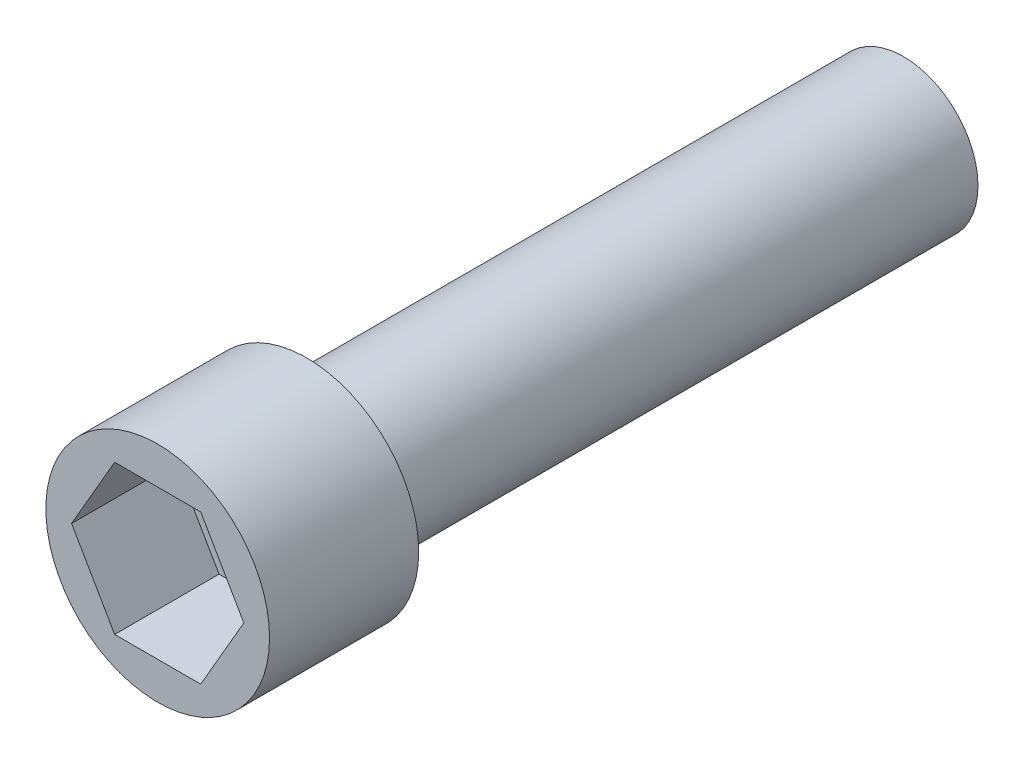
ISO-10303-21;
HEADER;
FILE_DESCRIPTION(('STEP AP214'),'2;1');
FILE_NAME('part.step','',(''),(''),'','','');
FILE_SCHEMA(('AUTOMOTIVE_DESIGN { 1 0 10303 214 1 1 1 1 }'));
ENDSEC;
DATA;
#1=APPLICATION_CONTEXT('core data for automotive mechanical design processes');
#2=APPLICATION_PROTOCOL_DEFINITION('international standard','automotive_design',2000,#1);
#3=PRODUCT_CONTEXT('',#1,'mechanical');
#4=PRODUCT('Part','Part','',(#3));
#5=PRODUCT_RELATED_PRODUCT_CATEGORY('part','',(#4));
#6=PRODUCT_DEFINITION_FORMATION('','',#4);
#7=PRODUCT_DEFINITION_CONTEXT('part definition',#1,'design');
#8=PRODUCT_DEFINITION('design','',#6,#7);
#9=PRODUCT_DEFINITION_SHAPE('','',#8);
#10=(LENGTH_UNIT() NAMED_UNIT(*) SI_UNIT(.MILLI.,.METRE.));
#11=(NAMED_UNIT(*) PLANE_ANGLE_UNIT() SI_UNIT($,.RADIAN.));
#12=(NAMED_UNIT(*) SI_UNIT($,.STERADIAN.) SOLID_ANGLE_UNIT());
#13=UNCERTAINTY_MEASURE_WITH_UNIT(LENGTH_MEASURE(1.E-05),#10,'distance_accuracy_value','');
#14=(GEOMETRIC_REPRESENTATION_CONTEXT(3) GLOBAL_UNCERTAINTY_ASSIGNED_CONTEXT((#13)) GLOBAL_UNIT_ASSIGNED_CONTEXT((#10,
#11,#12)) REPRESENTATION_CONTEXT('',''));
#15=CARTESIAN_POINT('',(0.,0.,0.));
#16=DIRECTION('',(0.,0.,1.));
#17=DIRECTION('',(1.,0.,0.));
#18=AXIS2_PLACEMENT_3D('',#15,#16,#17);
#19=CARTESIAN_POINT('',(0.,0.,0.));
#20=DIRECTION('',(0.,0.,1.));
#21=DIRECTION('',(1.,0.,0.));
#22=AXIS2_PLACEMENT_3D('',#19,#20,#21);
#23=PLANE('',#22);
#24=CARTESIAN_POINT('',(0.,0.,0.));
#25=DIRECTION('',(0.,0.,1.));
#26=DIRECTION('',(1.,0.,0.));
#27=AXIS2_PLACEMENT_3D('',#24,#25,#26);
#28=CIRCLE('',#27,7.5);
#29=CARTESIAN_POINT('',(7.5,0.,0.));
#30=VERTEX_POINT('',#29);
#31=EDGE_CURVE('E159',#30,#30,#28,.T.);
#32=ORIENTED_EDGE('',*,*,#31,.T.);
#33=EDGE_LOOP('',(#32));
#34=FACE_BOUND('',#33,.T.);
#35=DIRECTION('',(1.,0.,0.));
#36=VECTOR('',#35,1.);
#37=CARTESIAN_POINT('',(0.,5.,0.));
#38=LINE('',#37,#36);
#39=CARTESIAN_POINT('',(-2.88675134594815,4.99999999999999,0.));
#40=VERTEX_POINT('',#39);
#41=CARTESIAN_POINT('',(2.88675134594812,5.00000000000001,0.));
#42=VERTEX_POINT('',#41);
#43=EDGE_CURVE('E70',#40,#42,#38,.T.);
#44=ORIENTED_EDGE('',*,*,#43,.T.);
#45=DIRECTION('',(0.500000000000001,-0.866025403784438,0.));
#46=VECTOR('',#45,1.);
#47=CARTESIAN_POINT('',(4.33012701892219,2.50000000000001,0.));
#48=LINE('',#47,#46);
#49=CARTESIAN_POINT('',(5.77350269189626,0.,0.));
#50=VERTEX_POINT('',#49);
#51=EDGE_CURVE('E12',#42,#50,#48,.T.);
#52=ORIENTED_EDGE('',*,*,#51,.T.);
#53=DIRECTION('',(-0.499999999999995,-0.866025403784442,0.));
#54=VECTOR('',#53,1.);
#55=CARTESIAN_POINT('',(4.33012701892223,-2.49999999999999,0.));
#56=LINE('',#55,#54);
#57=CARTESIAN_POINT('',(2.88675134594819,-4.99999999999997,0.));
#58=VERTEX_POINT('',#57);
#59=EDGE_CURVE('E158',#50,#58,#56,.T.);
#60=ORIENTED_EDGE('',*,*,#59,.T.);
#61=DIRECTION('',(-1.,0.,0.));
#62=VECTOR('',#61,1.);
#63=CARTESIAN_POINT('',(0.,-5.,0.));
#64=LINE('',#63,#62);
#65=CARTESIAN_POINT('',(-2.88675134594808,-5.00000000000003,0.));
#66=VERTEX_POINT('',#65);
#67=EDGE_CURVE('E166',#58,#66,#64,.T.);
#68=ORIENTED_EDGE('',*,*,#67,.T.);
#69=DIRECTION('',(-0.500000000000007,0.866025403784435,0.));
#70=VECTOR('',#69,1.);
#71=CARTESIAN_POINT('',(-4.33012701892217,-2.50000000000003,0.));
#72=LINE('',#71,#70);
#73=CARTESIAN_POINT('',(-5.77350269189626,0.,0.));
#74=VERTEX_POINT('',#73);
#75=EDGE_CURVE('E169',#66,#74,#72,.T.);
#76=ORIENTED_EDGE('',*,*,#75,.T.);
#77=DIRECTION('',(0.499999999999995,0.866025403784442,0.));
#78=VECTOR('',#77,1.);
#79=CARTESIAN_POINT('',(-4.33012701892221,2.49999999999997,0.));
#80=LINE('',#79,#78);
#81=EDGE_CURVE('E172',#74,#40,#80,.T.);
#82=ORIENTED_EDGE('',*,*,#81,.T.);
#83=EDGE_LOOP('',(#44,#52,#60,#68,#76,#82));
#84=FACE_BOUND('',#83,.T.);
#85=ADVANCED_FACE('F62',(#34,#84),#23,.T.);
#86=CARTESIAN_POINT('',(0.,0.,-10.));
#87=DIRECTION('',(0.,0.,1.));
#88=DIRECTION('',(1.,0.,0.));
#89=AXIS2_PLACEMENT_3D('',#86,#87,#88);
#90=CYLINDRICAL_SURFACE('',#89,7.5);
#91=CARTESIAN_POINT('',(0.,0.,-10.));
#92=DIRECTION('',(0.,0.,1.));
#93=DIRECTION('',(1.,0.,0.));
#94=AXIS2_PLACEMENT_3D('',#91,#92,#93);
#95=CIRCLE('',#94,7.5);
#96=CARTESIAN_POINT('',(7.5,0.,-10.));
#97=VERTEX_POINT('',#96);
#98=EDGE_CURVE('E155',#97,#97,#95,.T.);
#99=ORIENTED_EDGE('',*,*,#98,.T.);
#100=EDGE_LOOP('',(#99));
#101=FACE_BOUND('',#100,.T.);
#102=ORIENTED_EDGE('',*,*,#31,.F.);
#103=EDGE_LOOP('',(#102));
#104=FACE_BOUND('',#103,.T.);
#105=ADVANCED_FACE('F64',(#101,#104),#90,.T.);
#106=CARTESIAN_POINT('',(0.,0.,-10.));
#107=DIRECTION('',(0.,0.,1.));
#108=DIRECTION('',(1.,0.,0.));
#109=AXIS2_PLACEMENT_3D('',#106,#107,#108);
#110=PLANE('',#109);
#111=CARTESIAN_POINT('',(0.,0.,-10.));
#112=DIRECTION('',(0.,0.,1.));
#113=DIRECTION('',(1.,0.,0.));
#114=AXIS2_PLACEMENT_3D('',#111,#112,#113);
#115=CIRCLE('',#114,5.);
#116=CARTESIAN_POINT('',(5.,0.,-10.));
#117=VERTEX_POINT('',#116);
#118=EDGE_CURVE('E154',#117,#117,#115,.T.);
#119=ORIENTED_EDGE('',*,*,#118,.T.);
#120=EDGE_LOOP('',(#119));
#121=FACE_BOUND('',#120,.T.);
#122=ORIENTED_EDGE('',*,*,#98,.F.);
#123=EDGE_LOOP('',(#122));
#124=FACE_BOUND('',#123,.T.);
#125=ADVANCED_FACE('F201',(#121,#124),#110,.F.);
#126=CARTESIAN_POINT('',(0.,0.,-50.));
#127=DIRECTION('',(0.,0.,1.));
#128=DIRECTION('',(1.,0.,0.));
#129=AXIS2_PLACEMENT_3D('',#126,#127,#128);
#130=CYLINDRICAL_SURFACE('',#129,5.);
#131=CARTESIAN_POINT('',(0.,0.,-50.));
#132=DIRECTION('',(0.,0.,1.));
#133=DIRECTION('',(1.,0.,0.));
#134=AXIS2_PLACEMENT_3D('',#131,#132,#133);
#135=CIRCLE('',#134,5.);
#136=CARTESIAN_POINT('',(5.,0.,-50.));
#137=VERTEX_POINT('',#136);
#138=EDGE_CURVE('E120',#137,#137,#135,.T.);
#139=ORIENTED_EDGE('',*,*,#138,.T.);
#140=EDGE_LOOP('',(#139));
#141=FACE_BOUND('',#140,.T.);
#142=ORIENTED_EDGE('',*,*,#118,.F.);
#143=EDGE_LOOP('',(#142));
#144=FACE_BOUND('',#143,.T.);
#145=ADVANCED_FACE('F206',(#141,#144),#130,.T.);
#146=CARTESIAN_POINT('',(0.,0.,-50.));
#147=DIRECTION('',(0.,0.,1.));
#148=DIRECTION('',(1.,0.,0.));
#149=AXIS2_PLACEMENT_3D('',#146,#147,#148);
#150=PLANE('',#149);
#151=ORIENTED_EDGE('',*,*,#138,.F.);
#152=EDGE_LOOP('',(#151));
#153=FACE_BOUND('',#152,.T.);
#154=ADVANCED_FACE('F210',(#153),#150,.F.);
#155=CARTESIAN_POINT('',(5.77350269189626,0.,1.2E-05));
#156=DIRECTION('',(-0.866025403784438,-0.500000000000001,0.));
#157=DIRECTION('',(0.500000000000001,-0.866025403784438,0.));
#158=AXIS2_PLACEMENT_3D('',#155,#156,#157);
#159=PLANE('',#158);
#160=DIRECTION('',(0.,0.,-1.));
#161=VECTOR('',#160,1.);
#162=CARTESIAN_POINT('',(2.88675134594812,5.00000000000001,1.2E-05));
#163=LINE('',#162,#161);
#164=CARTESIAN_POINT('',(2.88675134594812,5.00000000000001,-7.));
#165=VERTEX_POINT('',#164);
#166=EDGE_CURVE('E112',#42,#165,#163,.T.);
#167=ORIENTED_EDGE('',*,*,#166,.T.);
#168=DIRECTION('',(-0.500000000000001,0.866025403784438,0.));
#169=VECTOR('',#168,1.);
#170=CARTESIAN_POINT('',(5.77350269189626,0.,-7.));
#171=LINE('',#170,#169);
#172=CARTESIAN_POINT('',(5.77350269189626,0.,-7.));
#173=VERTEX_POINT('',#172);
#174=EDGE_CURVE('E116',#173,#165,#171,.T.);
#175=ORIENTED_EDGE('',*,*,#174,.F.);
#176=DIRECTION('',(0.,0.,-1.));
#177=VECTOR('',#176,1.);
#178=CARTESIAN_POINT('',(5.77350269189626,0.,1.2E-05));
#179=LINE('',#178,#177);
#180=EDGE_CURVE('E144',#50,#173,#179,.T.);
#181=ORIENTED_EDGE('',*,*,#180,.F.);
#182=ORIENTED_EDGE('',*,*,#51,.F.);
#183=EDGE_LOOP('',(#167,#175,#181,#182));
#184=FACE_BOUND('',#183,.T.);
#185=ADVANCED_FACE('F114',(#184),#159,.T.);
#186=CARTESIAN_POINT('',(2.88675134594812,5.00000000000001,1.2E-05));
#187=DIRECTION('',(0.,-1.,0.));
#188=DIRECTION('',(1.,0.,0.));
#189=AXIS2_PLACEMENT_3D('',#186,#187,#188);
#190=PLANE('',#189);
#191=DIRECTION('',(0.,0.,-1.));
#192=VECTOR('',#191,1.);
#193=CARTESIAN_POINT('',(-2.88675134594815,4.99999999999999,1.2E-05));
#194=LINE('',#193,#192);
#195=CARTESIAN_POINT('',(-2.88675134594815,4.99999999999999,-7.));
#196=VERTEX_POINT('',#195);
#197=EDGE_CURVE('E121',#40,#196,#194,.T.);
#198=ORIENTED_EDGE('',*,*,#197,.T.);
#199=DIRECTION('',(-1.,0.,0.));
#200=VECTOR('',#199,1.);
#201=CARTESIAN_POINT('',(2.88675134594812,5.00000000000001,-7.));
#202=LINE('',#201,#200);
#203=EDGE_CURVE('E124',#165,#196,#202,.T.);
#204=ORIENTED_EDGE('',*,*,#203,.F.);
#205=ORIENTED_EDGE('',*,*,#166,.F.);
#206=ORIENTED_EDGE('',*,*,#43,.F.);
#207=EDGE_LOOP('',(#198,#204,#205,#206));
#208=FACE_BOUND('',#207,.T.);
#209=ADVANCED_FACE('F125',(#208),#190,.T.);
#210=CARTESIAN_POINT('',(-2.88675134594815,4.99999999999999,1.2E-05));
#211=DIRECTION('',(0.866025403784441,-0.499999999999995,0.));
#212=DIRECTION('',(0.499999999999995,0.866025403784442,0.));
#213=AXIS2_PLACEMENT_3D('',#210,#211,#212);
#214=PLANE('',#213);
#215=DIRECTION('',(0.,0.,-1.));
#216=VECTOR('',#215,1.);
#217=CARTESIAN_POINT('',(-5.77350269189626,0.,1.2E-05));
#218=LINE('',#217,#216);
#219=CARTESIAN_POINT('',(-5.77350269189626,0.,-7.));
#220=VERTEX_POINT('',#219);
#221=EDGE_CURVE('E149',#74,#220,#218,.T.);
#222=ORIENTED_EDGE('',*,*,#221,.T.);
#223=DIRECTION('',(-0.499999999999995,-0.866025403784441,0.));
#224=VECTOR('',#223,1.);
#225=CARTESIAN_POINT('',(-2.88675134594815,4.99999999999999,-7.));
#226=LINE('',#225,#224);
#227=EDGE_CURVE('E130',#196,#220,#226,.T.);
#228=ORIENTED_EDGE('',*,*,#227,.F.);
#229=ORIENTED_EDGE('',*,*,#197,.F.);
#230=ORIENTED_EDGE('',*,*,#81,.F.);
#231=EDGE_LOOP('',(#222,#228,#229,#230));
#232=FACE_BOUND('',#231,.T.);
#233=ADVANCED_FACE('F176',(#232),#214,.T.);
#234=CARTESIAN_POINT('',(-5.77350269189626,0.,1.2E-05));
#235=DIRECTION('',(0.866025403784435,0.500000000000007,0.));
#236=DIRECTION('',(-0.500000000000007,0.866025403784435,0.));
#237=AXIS2_PLACEMENT_3D('',#234,#235,#236);
#238=PLANE('',#237);
#239=DIRECTION('',(0.,0.,-1.));
#240=VECTOR('',#239,1.);
#241=CARTESIAN_POINT('',(-2.88675134594808,-5.00000000000003,1.2E-05));
#242=LINE('',#241,#240);
#243=CARTESIAN_POINT('',(-2.88675134594808,-5.00000000000003,-7.));
#244=VERTEX_POINT('',#243);
#245=EDGE_CURVE('E147',#66,#244,#242,.T.);
#246=ORIENTED_EDGE('',*,*,#245,.T.);
#247=DIRECTION('',(0.500000000000007,-0.866025403784435,0.));
#248=VECTOR('',#247,1.);
#249=CARTESIAN_POINT('',(-5.77350269189626,0.,-7.));
#250=LINE('',#249,#248);
#251=EDGE_CURVE('E138',#220,#244,#250,.T.);
#252=ORIENTED_EDGE('',*,*,#251,.F.);
#253=ORIENTED_EDGE('',*,*,#221,.F.);
#254=ORIENTED_EDGE('',*,*,#75,.F.);
#255=EDGE_LOOP('',(#246,#252,#253,#254));
#256=FACE_BOUND('',#255,.T.);
#257=ADVANCED_FACE('F181',(#256),#238,.T.);
#258=CARTESIAN_POINT('',(-2.88675134594808,-5.00000000000003,1.2E-05));
#259=DIRECTION('',(0.,1.,0.));
#260=DIRECTION('',(-1.,0.,0.));
#261=AXIS2_PLACEMENT_3D('',#258,#259,#260);
#262=PLANE('',#261);
#263=DIRECTION('',(0.,0.,-1.));
#264=VECTOR('',#263,1.);
#265=CARTESIAN_POINT('',(2.88675134594819,-4.99999999999997,1.2E-05));
#266=LINE('',#265,#264);
#267=CARTESIAN_POINT('',(2.88675134594819,-4.99999999999997,-7.));
#268=VERTEX_POINT('',#267);
#269=EDGE_CURVE('E77',#58,#268,#266,.T.);
#270=ORIENTED_EDGE('',*,*,#269,.T.);
#271=DIRECTION('',(1.,0.,0.));
#272=VECTOR('',#271,1.);
#273=CARTESIAN_POINT('',(-2.88675134594808,-5.00000000000003,-7.));
#274=LINE('',#273,#272);
#275=EDGE_CURVE('E141',#244,#268,#274,.T.);
#276=ORIENTED_EDGE('',*,*,#275,.F.);
#277=ORIENTED_EDGE('',*,*,#245,.F.);
#278=ORIENTED_EDGE('',*,*,#67,.F.);
#279=EDGE_LOOP('',(#270,#276,#277,#278));
#280=FACE_BOUND('',#279,.T.);
#281=ADVANCED_FACE('F184',(#280),#262,.T.);
#282=CARTESIAN_POINT('',(2.88675134594819,-4.99999999999997,1.2E-05));
#283=DIRECTION('',(-0.866025403784441,0.499999999999995,0.));
#284=DIRECTION('',(-0.499999999999995,-0.866025403784442,0.));
#285=AXIS2_PLACEMENT_3D('',#282,#283,#284);
#286=PLANE('',#285);
#287=ORIENTED_EDGE('',*,*,#180,.T.);
#288=DIRECTION('',(0.499999999999995,0.866025403784441,0.));
#289=VECTOR('',#288,1.);
#290=CARTESIAN_POINT('',(2.88675134594819,-4.99999999999997,-7.));
#291=LINE('',#290,#289);
#292=EDGE_CURVE('E134',#268,#173,#291,.T.);
#293=ORIENTED_EDGE('',*,*,#292,.F.);
#294=ORIENTED_EDGE('',*,*,#269,.F.);
#295=ORIENTED_EDGE('',*,*,#59,.F.);
#296=EDGE_LOOP('',(#287,#293,#294,#295));
#297=FACE_BOUND('',#296,.T.);
#298=ADVANCED_FACE('F185',(#297),#286,.T.);
#299=CARTESIAN_POINT('',(0.,0.,-7.));
#300=DIRECTION('',(0.,0.,1.));
#301=DIRECTION('',(1.,0.,0.));
#302=AXIS2_PLACEMENT_3D('',#299,#300,#301);
#303=PLANE('',#302);
#304=ORIENTED_EDGE('',*,*,#174,.T.);
#305=ORIENTED_EDGE('',*,*,#203,.T.);
#306=ORIENTED_EDGE('',*,*,#227,.T.);
#307=ORIENTED_EDGE('',*,*,#251,.T.);
#308=ORIENTED_EDGE('',*,*,#275,.T.);
#309=ORIENTED_EDGE('',*,*,#292,.T.);
#310=EDGE_LOOP('',(#304,#305,#306,#307,#308,#309));
#311=FACE_BOUND('',#310,.T.);
#312=ADVANCED_FACE('F132',(#311),#303,.T.);
#313=CLOSED_SHELL('',(#85,#105,#125,#145,#154,#185,#209,#233,#257,#281,#298,#312));
#314=MANIFOLD_SOLID_BREP('B2',#313);
#315=ADVANCED_BREP_SHAPE_REPRESENTATION('',(#18,#314),#14);
#316=SHAPE_DEFINITION_REPRESENTATION(#9,#315);
ENDSEC;
END-ISO-10303-21;
